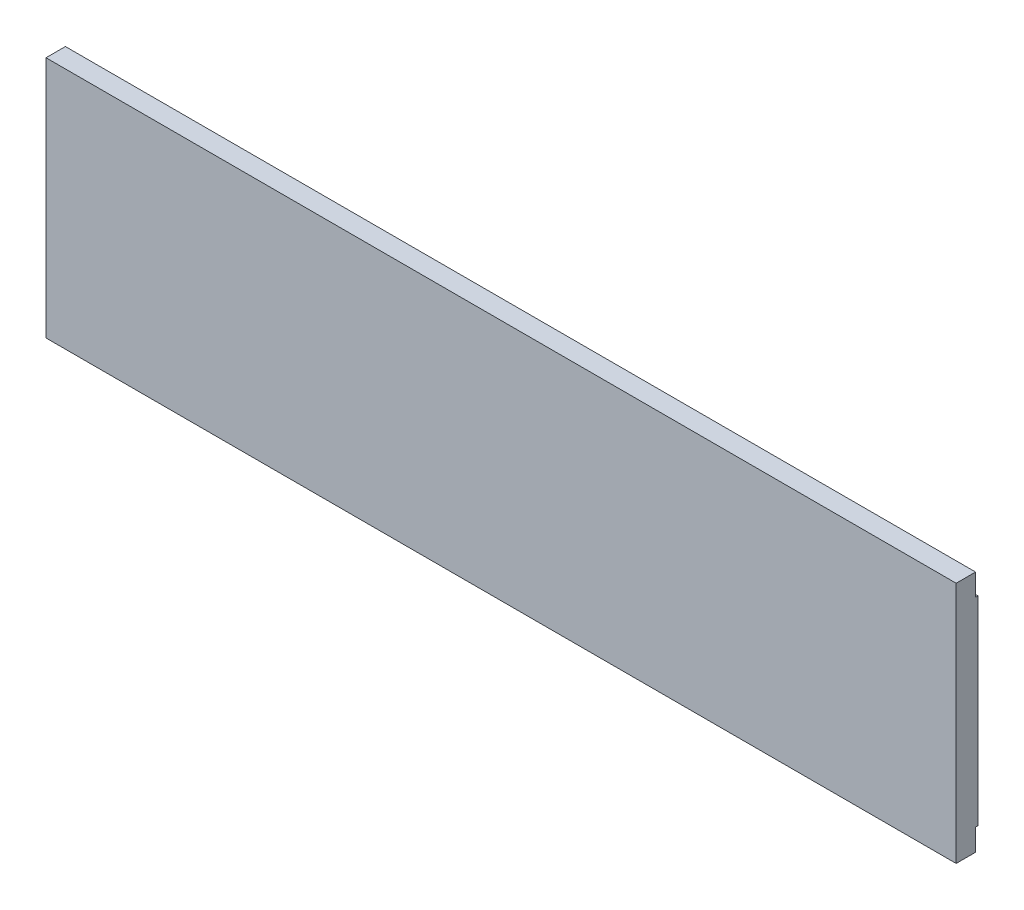
ISO-10303-21;
HEADER;
FILE_DESCRIPTION(('STEP AP214'),'2;1');
FILE_NAME('part.step','',(''),(''),'','','');
FILE_SCHEMA(('AUTOMOTIVE_DESIGN { 1 0 10303 214 1 1 1 1 }'));
ENDSEC;
DATA;
#1=APPLICATION_CONTEXT('core data for automotive mechanical design processes');
#2=APPLICATION_PROTOCOL_DEFINITION('international standard','automotive_design',2000,#1);
#3=PRODUCT_CONTEXT('',#1,'mechanical');
#4=PRODUCT('Part','Part','',(#3));
#5=PRODUCT_RELATED_PRODUCT_CATEGORY('part','',(#4));
#6=PRODUCT_DEFINITION_FORMATION('','',#4);
#7=PRODUCT_DEFINITION_CONTEXT('part definition',#1,'design');
#8=PRODUCT_DEFINITION('design','',#6,#7);
#9=PRODUCT_DEFINITION_SHAPE('','',#8);
#10=(LENGTH_UNIT() NAMED_UNIT(*) SI_UNIT(.MILLI.,.METRE.));
#11=(NAMED_UNIT(*) PLANE_ANGLE_UNIT() SI_UNIT($,.RADIAN.));
#12=(NAMED_UNIT(*) SI_UNIT($,.STERADIAN.) SOLID_ANGLE_UNIT());
#13=UNCERTAINTY_MEASURE_WITH_UNIT(LENGTH_MEASURE(1.E-05),#10,'distance_accuracy_value','');
#14=(GEOMETRIC_REPRESENTATION_CONTEXT(3) GLOBAL_UNCERTAINTY_ASSIGNED_CONTEXT((#13)) GLOBAL_UNIT_ASSIGNED_CONTEXT((#10,
#11,#12)) REPRESENTATION_CONTEXT('',''));
#15=CARTESIAN_POINT('',(0.,0.,0.));
#16=DIRECTION('',(0.,0.,1.));
#17=DIRECTION('',(1.,0.,0.));
#18=AXIS2_PLACEMENT_3D('',#15,#16,#17);
#19=CARTESIAN_POINT('',(0.,0.,0.));
#20=DIRECTION('',(0.,0.,1.));
#21=DIRECTION('',(1.,0.,0.));
#22=AXIS2_PLACEMENT_3D('',#19,#20,#21);
#23=PLANE('',#22);
#24=DIRECTION('',(-1.,0.,0.));
#25=VECTOR('',#24,1.);
#26=CARTESIAN_POINT('',(375.,82.,0.));
#27=LINE('',#26,#25);
#28=CARTESIAN_POINT('',(267.,82.,0.));
#29=VERTEX_POINT('',#28);
#30=CARTESIAN_POINT('',(147.,82.,0.));
#31=VERTEX_POINT('',#30);
#32=EDGE_CURVE('E231',#29,#31,#27,.T.);
#33=ORIENTED_EDGE('',*,*,#32,.F.);
#34=DIRECTION('',(0.,1.,0.));
#35=VECTOR('',#34,1.);
#36=CARTESIAN_POINT('',(267.,-136.962613609001,0.));
#37=LINE('',#36,#35);
#38=CARTESIAN_POINT('',(267.,-82.,0.));
#39=VERTEX_POINT('',#38);
#40=EDGE_CURVE('E220',#39,#29,#37,.T.);
#41=ORIENTED_EDGE('',*,*,#40,.F.);
#42=DIRECTION('',(-1.,0.,0.));
#43=VECTOR('',#42,1.);
#44=CARTESIAN_POINT('',(375.,-82.,0.));
#45=LINE('',#44,#43);
#46=CARTESIAN_POINT('',(147.,-82.,0.));
#47=VERTEX_POINT('',#46);
#48=EDGE_CURVE('E229',#39,#47,#45,.T.);
#49=ORIENTED_EDGE('',*,*,#48,.T.);
#50=DIRECTION('',(0.,-1.,0.));
#51=VECTOR('',#50,1.);
#52=CARTESIAN_POINT('',(147.,-149.113991927209,0.));
#53=LINE('',#52,#51);
#54=EDGE_CURVE('E394',#31,#47,#53,.T.);
#55=ORIENTED_EDGE('',*,*,#54,.F.);
#56=EDGE_LOOP('',(#33,#41,#49,#55));
#57=FACE_BOUND('',#56,.T.);
#58=ADVANCED_FACE('F33',(#57),#23,.F.);
#59=CARTESIAN_POINT('',(375.,-82.,0.));
#60=DIRECTION('',(0.,1.,0.));
#61=DIRECTION('',(0.,0.,1.));
#62=AXIS2_PLACEMENT_3D('',#59,#60,#61);
#63=PLANE('',#62);
#64=ORIENTED_EDGE('',*,*,#48,.F.);
#65=DIRECTION('',(0.,0.,1.));
#66=VECTOR('',#65,1.);
#67=CARTESIAN_POINT('',(267.,-82.,0.));
#68=LINE('',#67,#66);
#69=CARTESIAN_POINT('',(267.,-82.,2.));
#70=VERTEX_POINT('',#69);
#71=EDGE_CURVE('E217',#39,#70,#68,.T.);
#72=ORIENTED_EDGE('',*,*,#71,.T.);
#73=DIRECTION('',(-1.,0.,0.));
#74=VECTOR('',#73,1.);
#75=CARTESIAN_POINT('',(375.,-82.,2.));
#76=LINE('',#75,#74);
#77=CARTESIAN_POINT('',(147.,-82.,2.));
#78=VERTEX_POINT('',#77);
#79=EDGE_CURVE('E252',#70,#78,#76,.T.);
#80=ORIENTED_EDGE('',*,*,#79,.T.);
#81=DIRECTION('',(0.,0.,-1.));
#82=VECTOR('',#81,1.);
#83=CARTESIAN_POINT('',(147.,-82.,0.));
#84=LINE('',#83,#82);
#85=EDGE_CURVE('E237',#78,#47,#84,.T.);
#86=ORIENTED_EDGE('',*,*,#85,.T.);
#87=EDGE_LOOP('',(#64,#72,#80,#86));
#88=FACE_BOUND('',#87,.T.);
#89=ADVANCED_FACE('F235',(#88),#63,.F.);
#90=CARTESIAN_POINT('',(375.,82.,0.));
#91=DIRECTION('',(0.,-1.,0.));
#92=DIRECTION('',(0.,0.,-1.));
#93=AXIS2_PLACEMENT_3D('',#90,#91,#92);
#94=PLANE('',#93);
#95=DIRECTION('',(-1.,0.,0.));
#96=VECTOR('',#95,1.);
#97=CARTESIAN_POINT('',(375.,82.,2.));
#98=LINE('',#97,#96);
#99=CARTESIAN_POINT('',(267.,82.,2.));
#100=VERTEX_POINT('',#99);
#101=CARTESIAN_POINT('',(147.,82.,2.));
#102=VERTEX_POINT('',#101);
#103=EDGE_CURVE('E325',#100,#102,#98,.T.);
#104=ORIENTED_EDGE('',*,*,#103,.F.);
#105=DIRECTION('',(0.,0.,-1.));
#106=VECTOR('',#105,1.);
#107=CARTESIAN_POINT('',(267.,82.,0.));
#108=LINE('',#107,#106);
#109=EDGE_CURVE('E11',#100,#29,#108,.T.);
#110=ORIENTED_EDGE('',*,*,#109,.T.);
#111=ORIENTED_EDGE('',*,*,#32,.T.);
#112=DIRECTION('',(0.,0.,1.));
#113=VECTOR('',#112,1.);
#114=CARTESIAN_POINT('',(147.,82.,0.));
#115=LINE('',#114,#113);
#116=EDGE_CURVE('E301',#31,#102,#115,.T.);
#117=ORIENTED_EDGE('',*,*,#116,.T.);
#118=EDGE_LOOP('',(#104,#110,#111,#117));
#119=FACE_BOUND('',#118,.T.);
#120=ADVANCED_FACE('F471',(#119),#94,.F.);
#121=CARTESIAN_POINT('',(129.,82.,0.));
#122=VERTEX_POINT('',#121);
#123=CARTESIAN_POINT('',(8.99999999999996,82.,0.));
#124=VERTEX_POINT('',#123);
#125=EDGE_CURVE('E338',#122,#124,#27,.T.);
#126=ORIENTED_EDGE('',*,*,#125,.F.);
#127=DIRECTION('',(0.,1.,0.));
#128=VECTOR('',#127,1.);
#129=CARTESIAN_POINT('',(129.,-149.113991927209,0.));
#130=LINE('',#129,#128);
#131=CARTESIAN_POINT('',(129.,-82.,0.));
#132=VERTEX_POINT('',#131);
#133=EDGE_CURVE('E223',#132,#122,#130,.T.);
#134=ORIENTED_EDGE('',*,*,#133,.F.);
#135=CARTESIAN_POINT('',(8.99999999999996,-82.,0.));
#136=VERTEX_POINT('',#135);
#137=EDGE_CURVE('E239',#132,#136,#45,.T.);
#138=ORIENTED_EDGE('',*,*,#137,.T.);
#139=DIRECTION('',(0.,-1.,0.));
#140=VECTOR('',#139,1.);
#141=CARTESIAN_POINT('',(8.99999999999997,-149.113991927209,0.));
#142=LINE('',#141,#140);
#143=EDGE_CURVE('E407',#124,#136,#142,.T.);
#144=ORIENTED_EDGE('',*,*,#143,.F.);
#145=EDGE_LOOP('',(#126,#134,#138,#144));
#146=FACE_BOUND('',#145,.T.);
#147=ADVANCED_FACE('F473',(#146),#23,.F.);
#148=ORIENTED_EDGE('',*,*,#137,.F.);
#149=DIRECTION('',(0.,0.,1.));
#150=VECTOR('',#149,1.);
#151=CARTESIAN_POINT('',(129.,-82.,0.));
#152=LINE('',#151,#150);
#153=CARTESIAN_POINT('',(129.,-82.,2.));
#154=VERTEX_POINT('',#153);
#155=EDGE_CURVE('E400',#132,#154,#152,.T.);
#156=ORIENTED_EDGE('',*,*,#155,.T.);
#157=CARTESIAN_POINT('',(8.99999999999996,-82.,2.));
#158=VERTEX_POINT('',#157);
#159=EDGE_CURVE('E459',#154,#158,#76,.T.);
#160=ORIENTED_EDGE('',*,*,#159,.T.);
#161=DIRECTION('',(0.,0.,-1.));
#162=VECTOR('',#161,1.);
#163=CARTESIAN_POINT('',(8.99999999999995,-82.,0.));
#164=LINE('',#163,#162);
#165=EDGE_CURVE('E410',#158,#136,#164,.T.);
#166=ORIENTED_EDGE('',*,*,#165,.T.);
#167=EDGE_LOOP('',(#148,#156,#160,#166));
#168=FACE_BOUND('',#167,.T.);
#169=ADVANCED_FACE('F480',(#168),#63,.F.);
#170=CARTESIAN_POINT('',(129.,82.,2.));
#171=VERTEX_POINT('',#170);
#172=CARTESIAN_POINT('',(8.99999999999996,82.,2.));
#173=VERTEX_POINT('',#172);
#174=EDGE_CURVE('E330',#171,#173,#98,.T.);
#175=ORIENTED_EDGE('',*,*,#174,.F.);
#176=DIRECTION('',(0.,0.,-1.));
#177=VECTOR('',#176,1.);
#178=CARTESIAN_POINT('',(129.,82.,0.));
#179=LINE('',#178,#177);
#180=EDGE_CURVE('E304',#171,#122,#179,.T.);
#181=ORIENTED_EDGE('',*,*,#180,.T.);
#182=ORIENTED_EDGE('',*,*,#125,.T.);
#183=DIRECTION('',(0.,0.,1.));
#184=VECTOR('',#183,1.);
#185=CARTESIAN_POINT('',(8.99999999999995,82.,0.));
#186=LINE('',#185,#184);
#187=EDGE_CURVE('E295',#124,#173,#186,.T.);
#188=ORIENTED_EDGE('',*,*,#187,.T.);
#189=EDGE_LOOP('',(#175,#181,#182,#188));
#190=FACE_BOUND('',#189,.T.);
#191=ADVANCED_FACE('F475',(#190),#94,.F.);
#192=CARTESIAN_POINT('',(-9.00000000000004,82.,0.));
#193=VERTEX_POINT('',#192);
#194=CARTESIAN_POINT('',(-129.,82.,0.));
#195=VERTEX_POINT('',#194);
#196=EDGE_CURVE('E344',#193,#195,#27,.T.);
#197=ORIENTED_EDGE('',*,*,#196,.F.);
#198=DIRECTION('',(0.,1.,0.));
#199=VECTOR('',#198,1.);
#200=CARTESIAN_POINT('',(-9.00000000000004,-149.113991927209,0.));
#201=LINE('',#200,#199);
#202=CARTESIAN_POINT('',(-9.00000000000004,-82.,0.));
#203=VERTEX_POINT('',#202);
#204=EDGE_CURVE('E403',#203,#193,#201,.T.);
#205=ORIENTED_EDGE('',*,*,#204,.F.);
#206=CARTESIAN_POINT('',(-129.,-82.,0.));
#207=VERTEX_POINT('',#206);
#208=EDGE_CURVE('E244',#203,#207,#45,.T.);
#209=ORIENTED_EDGE('',*,*,#208,.T.);
#210=DIRECTION('',(0.,-1.,0.));
#211=VECTOR('',#210,1.);
#212=CARTESIAN_POINT('',(-129.,-160.738550975509,0.));
#213=LINE('',#212,#211);
#214=EDGE_CURVE('E423',#195,#207,#213,.T.);
#215=ORIENTED_EDGE('',*,*,#214,.F.);
#216=EDGE_LOOP('',(#197,#205,#209,#215));
#217=FACE_BOUND('',#216,.T.);
#218=ADVANCED_FACE('F483',(#217),#23,.F.);
#219=ORIENTED_EDGE('',*,*,#208,.F.);
#220=DIRECTION('',(0.,0.,1.));
#221=VECTOR('',#220,1.);
#222=CARTESIAN_POINT('',(-9.00000000000001,-82.,0.));
#223=LINE('',#222,#221);
#224=CARTESIAN_POINT('',(-9.00000000000004,-82.,2.));
#225=VERTEX_POINT('',#224);
#226=EDGE_CURVE('E416',#203,#225,#223,.T.);
#227=ORIENTED_EDGE('',*,*,#226,.T.);
#228=CARTESIAN_POINT('',(-129.,-82.,2.));
#229=VERTEX_POINT('',#228);
#230=EDGE_CURVE('E455',#225,#229,#76,.T.);
#231=ORIENTED_EDGE('',*,*,#230,.T.);
#232=DIRECTION('',(0.,0.,-1.));
#233=VECTOR('',#232,1.);
#234=CARTESIAN_POINT('',(-129.,-82.,0.));
#235=LINE('',#234,#233);
#236=EDGE_CURVE('E426',#229,#207,#235,.T.);
#237=ORIENTED_EDGE('',*,*,#236,.T.);
#238=EDGE_LOOP('',(#219,#227,#231,#237));
#239=FACE_BOUND('',#238,.T.);
#240=ADVANCED_FACE('F522',(#239),#63,.F.);
#241=CARTESIAN_POINT('',(-9.00000000000006,82.,2.));
#242=VERTEX_POINT('',#241);
#243=CARTESIAN_POINT('',(-129.,82.,2.));
#244=VERTEX_POINT('',#243);
#245=EDGE_CURVE('E336',#242,#244,#98,.T.);
#246=ORIENTED_EDGE('',*,*,#245,.F.);
#247=DIRECTION('',(0.,0.,-1.));
#248=VECTOR('',#247,1.);
#249=CARTESIAN_POINT('',(-9.00000000000001,82.,0.));
#250=LINE('',#249,#248);
#251=EDGE_CURVE('E298',#242,#193,#250,.T.);
#252=ORIENTED_EDGE('',*,*,#251,.T.);
#253=ORIENTED_EDGE('',*,*,#196,.T.);
#254=DIRECTION('',(0.,0.,1.));
#255=VECTOR('',#254,1.);
#256=CARTESIAN_POINT('',(-129.,82.,0.));
#257=LINE('',#256,#255);
#258=EDGE_CURVE('E289',#195,#244,#257,.T.);
#259=ORIENTED_EDGE('',*,*,#258,.T.);
#260=EDGE_LOOP('',(#246,#252,#253,#259));
#261=FACE_BOUND('',#260,.T.);
#262=ADVANCED_FACE('F489',(#261),#94,.F.);
#263=CARTESIAN_POINT('',(-147.,82.,0.));
#264=VERTEX_POINT('',#263);
#265=CARTESIAN_POINT('',(-267.,82.,0.));
#266=VERTEX_POINT('',#265);
#267=EDGE_CURVE('E340',#264,#266,#27,.T.);
#268=ORIENTED_EDGE('',*,*,#267,.F.);
#269=DIRECTION('',(0.,1.,0.));
#270=VECTOR('',#269,1.);
#271=CARTESIAN_POINT('',(-147.,-160.738550975509,0.));
#272=LINE('',#271,#270);
#273=CARTESIAN_POINT('',(-147.,-82.,0.));
#274=VERTEX_POINT('',#273);
#275=EDGE_CURVE('E419',#274,#264,#272,.T.);
#276=ORIENTED_EDGE('',*,*,#275,.F.);
#277=CARTESIAN_POINT('',(-267.,-82.,0.));
#278=VERTEX_POINT('',#277);
#279=EDGE_CURVE('E551',#274,#278,#45,.T.);
#280=ORIENTED_EDGE('',*,*,#279,.T.);
#281=DIRECTION('',(0.,-1.,0.));
#282=VECTOR('',#281,1.);
#283=CARTESIAN_POINT('',(-267.,-136.962613609001,0.));
#284=LINE('',#283,#282);
#285=EDGE_CURVE('E439',#266,#278,#284,.T.);
#286=ORIENTED_EDGE('',*,*,#285,.F.);
#287=EDGE_LOOP('',(#268,#276,#280,#286));
#288=FACE_BOUND('',#287,.T.);
#289=ADVANCED_FACE('F509',(#288),#23,.F.);
#290=ORIENTED_EDGE('',*,*,#279,.F.);
#291=DIRECTION('',(0.,0.,1.));
#292=VECTOR('',#291,1.);
#293=CARTESIAN_POINT('',(-147.,-82.,0.));
#294=LINE('',#293,#292);
#295=CARTESIAN_POINT('',(-147.,-82.,2.));
#296=VERTEX_POINT('',#295);
#297=EDGE_CURVE('E432',#274,#296,#294,.T.);
#298=ORIENTED_EDGE('',*,*,#297,.T.);
#299=CARTESIAN_POINT('',(-267.,-82.,2.));
#300=VERTEX_POINT('',#299);
#301=EDGE_CURVE('E454',#296,#300,#76,.T.);
#302=ORIENTED_EDGE('',*,*,#301,.T.);
#303=DIRECTION('',(0.,0.,-1.));
#304=VECTOR('',#303,1.);
#305=CARTESIAN_POINT('',(-267.,-82.,0.));
#306=LINE('',#305,#304);
#307=EDGE_CURVE('E442',#300,#278,#306,.T.);
#308=ORIENTED_EDGE('',*,*,#307,.T.);
#309=EDGE_LOOP('',(#290,#298,#302,#308));
#310=FACE_BOUND('',#309,.T.);
#311=ADVANCED_FACE('F514',(#310),#63,.F.);
#312=CARTESIAN_POINT('',(-147.,82.,2.));
#313=VERTEX_POINT('',#312);
#314=CARTESIAN_POINT('',(-267.,82.,2.));
#315=VERTEX_POINT('',#314);
#316=EDGE_CURVE('E332',#313,#315,#98,.T.);
#317=ORIENTED_EDGE('',*,*,#316,.F.);
#318=DIRECTION('',(0.,0.,-1.));
#319=VECTOR('',#318,1.);
#320=CARTESIAN_POINT('',(-147.,82.,0.));
#321=LINE('',#320,#319);
#322=EDGE_CURVE('E292',#313,#264,#321,.T.);
#323=ORIENTED_EDGE('',*,*,#322,.T.);
#324=ORIENTED_EDGE('',*,*,#267,.T.);
#325=DIRECTION('',(0.,0.,1.));
#326=VECTOR('',#325,1.);
#327=CARTESIAN_POINT('',(-267.,82.,0.));
#328=LINE('',#327,#326);
#329=EDGE_CURVE('E283',#266,#315,#328,.T.);
#330=ORIENTED_EDGE('',*,*,#329,.T.);
#331=EDGE_LOOP('',(#317,#323,#324,#330));
#332=FACE_BOUND('',#331,.T.);
#333=ADVANCED_FACE('F507',(#332),#94,.F.);
#334=CARTESIAN_POINT('',(-285.,82.,0.));
#335=VERTEX_POINT('',#334);
#336=CARTESIAN_POINT('',(-375.,82.,0.));
#337=VERTEX_POINT('',#336);
#338=EDGE_CURVE('E337',#335,#337,#27,.T.);
#339=ORIENTED_EDGE('',*,*,#338,.F.);
#340=DIRECTION('',(0.,1.,0.));
#341=VECTOR('',#340,1.);
#342=CARTESIAN_POINT('',(-285.,-136.962613609001,0.));
#343=LINE('',#342,#341);
#344=CARTESIAN_POINT('',(-285.,-82.,0.));
#345=VERTEX_POINT('',#344);
#346=EDGE_CURVE('E435',#345,#335,#343,.T.);
#347=ORIENTED_EDGE('',*,*,#346,.F.);
#348=CARTESIAN_POINT('',(-375.,-82.,0.));
#349=VERTEX_POINT('',#348);
#350=EDGE_CURVE('E243',#345,#349,#45,.T.);
#351=ORIENTED_EDGE('',*,*,#350,.T.);
#352=DIRECTION('',(0.,-1.,0.));
#353=VECTOR('',#352,1.);
#354=CARTESIAN_POINT('',(-375.,100.,0.));
#355=LINE('',#354,#353);
#356=EDGE_CURVE('E261',#337,#349,#355,.T.);
#357=ORIENTED_EDGE('',*,*,#356,.F.);
#358=EDGE_LOOP('',(#339,#347,#351,#357));
#359=FACE_BOUND('',#358,.T.);
#360=ADVANCED_FACE('F500',(#359),#23,.F.);
#361=ORIENTED_EDGE('',*,*,#350,.F.);
#362=DIRECTION('',(0.,0.,1.));
#363=VECTOR('',#362,1.);
#364=CARTESIAN_POINT('',(-285.,-82.,0.));
#365=LINE('',#364,#363);
#366=CARTESIAN_POINT('',(-285.,-82.,2.));
#367=VERTEX_POINT('',#366);
#368=EDGE_CURVE('E355',#345,#367,#365,.T.);
#369=ORIENTED_EDGE('',*,*,#368,.T.);
#370=CARTESIAN_POINT('',(-375.,-82.,2.));
#371=VERTEX_POINT('',#370);
#372=EDGE_CURVE('E253',#367,#371,#76,.T.);
#373=ORIENTED_EDGE('',*,*,#372,.T.);
#374=DIRECTION('',(0.,0.,-1.));
#375=VECTOR('',#374,1.);
#376=CARTESIAN_POINT('',(-375.,-82.,0.));
#377=LINE('',#376,#375);
#378=EDGE_CURVE('E247',#371,#349,#377,.T.);
#379=ORIENTED_EDGE('',*,*,#378,.T.);
#380=EDGE_LOOP('',(#361,#369,#373,#379));
#381=FACE_BOUND('',#380,.T.);
#382=ADVANCED_FACE('F450',(#381),#63,.F.);
#383=CARTESIAN_POINT('',(-285.,82.,2.));
#384=VERTEX_POINT('',#383);
#385=CARTESIAN_POINT('',(-375.,82.,2.));
#386=VERTEX_POINT('',#385);
#387=EDGE_CURVE('E327',#384,#386,#98,.T.);
#388=ORIENTED_EDGE('',*,*,#387,.F.);
#389=DIRECTION('',(0.,0.,-1.));
#390=VECTOR('',#389,1.);
#391=CARTESIAN_POINT('',(-285.,82.,0.));
#392=LINE('',#391,#390);
#393=EDGE_CURVE('E286',#384,#335,#392,.T.);
#394=ORIENTED_EDGE('',*,*,#393,.T.);
#395=ORIENTED_EDGE('',*,*,#338,.T.);
#396=DIRECTION('',(0.,0.,1.));
#397=VECTOR('',#396,1.);
#398=CARTESIAN_POINT('',(-375.,82.,0.));
#399=LINE('',#398,#397);
#400=EDGE_CURVE('E353',#337,#386,#399,.T.);
#401=ORIENTED_EDGE('',*,*,#400,.T.);
#402=EDGE_LOOP('',(#388,#394,#395,#401));
#403=FACE_BOUND('',#402,.T.);
#404=ADVANCED_FACE('F492',(#403),#94,.F.);
#405=CARTESIAN_POINT('',(375.,100.,18.));
#406=DIRECTION('',(-1.,0.,0.));
#407=DIRECTION('',(0.,0.,1.));
#408=AXIS2_PLACEMENT_3D('',#405,#406,#407);
#409=PLANE('',#408);
#410=DIRECTION('',(0.,0.,1.));
#411=VECTOR('',#410,1.);
#412=CARTESIAN_POINT('',(375.,82.,0.));
#413=LINE('',#412,#411);
#414=CARTESIAN_POINT('',(375.,82.,0.));
#415=VERTEX_POINT('',#414);
#416=CARTESIAN_POINT('',(375.,82.,2.));
#417=VERTEX_POINT('',#416);
#418=EDGE_CURVE('E345',#415,#417,#413,.T.);
#419=ORIENTED_EDGE('',*,*,#418,.T.);
#420=DIRECTION('',(0.,1.,0.));
#421=VECTOR('',#420,1.);
#422=CARTESIAN_POINT('',(375.,100.,2.));
#423=LINE('',#422,#421);
#424=CARTESIAN_POINT('',(375.,100.,2.));
#425=VERTEX_POINT('',#424);
#426=EDGE_CURVE('E322',#417,#425,#423,.T.);
#427=ORIENTED_EDGE('',*,*,#426,.T.);
#428=DIRECTION('',(0.,0.,-1.));
#429=VECTOR('',#428,1.);
#430=CARTESIAN_POINT('',(375.,100.,18.));
#431=LINE('',#430,#429);
#432=CARTESIAN_POINT('',(375.,100.,18.));
#433=VERTEX_POINT('',#432);
#434=EDGE_CURVE('E280',#433,#425,#431,.T.);
#435=ORIENTED_EDGE('',*,*,#434,.F.);
#436=DIRECTION('',(0.,1.,0.));
#437=VECTOR('',#436,1.);
#438=CARTESIAN_POINT('',(375.,100.,18.));
#439=LINE('',#438,#437);
#440=CARTESIAN_POINT('',(375.,-100.,18.));
#441=VERTEX_POINT('',#440);
#442=EDGE_CURVE('E257',#441,#433,#439,.T.);
#443=ORIENTED_EDGE('',*,*,#442,.F.);
#444=DIRECTION('',(0.,0.,-1.));
#445=VECTOR('',#444,1.);
#446=CARTESIAN_POINT('',(375.,-100.,18.));
#447=LINE('',#446,#445);
#448=CARTESIAN_POINT('',(375.,-100.,2.));
#449=VERTEX_POINT('',#448);
#450=EDGE_CURVE('E267',#441,#449,#447,.T.);
#451=ORIENTED_EDGE('',*,*,#450,.T.);
#452=DIRECTION('',(0.,1.,0.));
#453=VECTOR('',#452,1.);
#454=CARTESIAN_POINT('',(375.,-100.,2.));
#455=LINE('',#454,#453);
#456=CARTESIAN_POINT('',(375.,-82.,2.));
#457=VERTEX_POINT('',#456);
#458=EDGE_CURVE('E377',#449,#457,#455,.T.);
#459=ORIENTED_EDGE('',*,*,#458,.T.);
#460=DIRECTION('',(0.,0.,-1.));
#461=VECTOR('',#460,1.);
#462=CARTESIAN_POINT('',(375.,-82.,0.));
#463=LINE('',#462,#461);
#464=CARTESIAN_POINT('',(375.,-82.,0.));
#465=VERTEX_POINT('',#464);
#466=EDGE_CURVE('E256',#457,#465,#463,.T.);
#467=ORIENTED_EDGE('',*,*,#466,.T.);
#468=DIRECTION('',(0.,1.,0.));
#469=VECTOR('',#468,1.);
#470=CARTESIAN_POINT('',(375.,100.,0.));
#471=LINE('',#470,#469);
#472=EDGE_CURVE('E242',#465,#415,#471,.T.);
#473=ORIENTED_EDGE('',*,*,#472,.T.);
#474=EDGE_LOOP('',(#419,#427,#435,#443,#451,#459,#467,#473));
#475=FACE_BOUND('',#474,.T.);
#476=ADVANCED_FACE('F35',(#475),#409,.F.);
#477=CARTESIAN_POINT('',(-375.,100.,18.));
#478=DIRECTION('',(0.,-1.,0.));
#479=DIRECTION('',(0.,0.,-1.));
#480=AXIS2_PLACEMENT_3D('',#477,#478,#479);
#481=PLANE('',#480);
#482=ORIENTED_EDGE('',*,*,#434,.T.);
#483=DIRECTION('',(-1.,0.,0.));
#484=VECTOR('',#483,1.);
#485=CARTESIAN_POINT('',(375.,100.,2.));
#486=LINE('',#485,#484);
#487=CARTESIAN_POINT('',(-375.,100.,2.));
#488=VERTEX_POINT('',#487);
#489=EDGE_CURVE('E324',#425,#488,#486,.T.);
#490=ORIENTED_EDGE('',*,*,#489,.T.);
#491=DIRECTION('',(0.,0.,-1.));
#492=VECTOR('',#491,1.);
#493=CARTESIAN_POINT('',(-375.,100.,18.));
#494=LINE('',#493,#492);
#495=CARTESIAN_POINT('',(-375.,100.,18.));
#496=VERTEX_POINT('',#495);
#497=EDGE_CURVE('E277',#496,#488,#494,.T.);
#498=ORIENTED_EDGE('',*,*,#497,.F.);
#499=DIRECTION('',(-1.,0.,0.));
#500=VECTOR('',#499,1.);
#501=CARTESIAN_POINT('',(-375.,100.,18.));
#502=LINE('',#501,#500);
#503=EDGE_CURVE('E260',#433,#496,#502,.T.);
#504=ORIENTED_EDGE('',*,*,#503,.F.);
#505=EDGE_LOOP('',(#482,#490,#498,#504));
#506=FACE_BOUND('',#505,.T.);
#507=ADVANCED_FACE('F363',(#506),#481,.F.);
#508=CARTESIAN_POINT('',(-375.,100.,18.));
#509=DIRECTION('',(1.,0.,0.));
#510=DIRECTION('',(0.,0.,-1.));
#511=AXIS2_PLACEMENT_3D('',#508,#509,#510);
#512=PLANE('',#511);
#513=ORIENTED_EDGE('',*,*,#497,.T.);
#514=DIRECTION('',(0.,1.,0.));
#515=VECTOR('',#514,1.);
#516=CARTESIAN_POINT('',(-375.,100.,2.));
#517=LINE('',#516,#515);
#518=EDGE_CURVE('E349',#386,#488,#517,.T.);
#519=ORIENTED_EDGE('',*,*,#518,.F.);
#520=ORIENTED_EDGE('',*,*,#400,.F.);
#521=ORIENTED_EDGE('',*,*,#356,.T.);
#522=ORIENTED_EDGE('',*,*,#378,.F.);
#523=DIRECTION('',(0.,1.,0.));
#524=VECTOR('',#523,1.);
#525=CARTESIAN_POINT('',(-375.,-100.,2.));
#526=LINE('',#525,#524);
#527=CARTESIAN_POINT('',(-375.,-100.,2.));
#528=VERTEX_POINT('',#527);
#529=EDGE_CURVE('E328',#528,#371,#526,.T.);
#530=ORIENTED_EDGE('',*,*,#529,.F.);
#531=DIRECTION('',(0.,0.,-1.));
#532=VECTOR('',#531,1.);
#533=CARTESIAN_POINT('',(-375.,-100.,18.));
#534=LINE('',#533,#532);
#535=CARTESIAN_POINT('',(-375.,-100.,18.));
#536=VERTEX_POINT('',#535);
#537=EDGE_CURVE('E274',#536,#528,#534,.T.);
#538=ORIENTED_EDGE('',*,*,#537,.F.);
#539=DIRECTION('',(0.,-1.,0.));
#540=VECTOR('',#539,1.);
#541=CARTESIAN_POINT('',(-375.,100.,18.));
#542=LINE('',#541,#540);
#543=EDGE_CURVE('E263',#496,#536,#542,.T.);
#544=ORIENTED_EDGE('',*,*,#543,.F.);
#545=EDGE_LOOP('',(#513,#519,#520,#521,#522,#530,#538,#544));
#546=FACE_BOUND('',#545,.T.);
#547=ADVANCED_FACE('F360',(#546),#512,.F.);
#548=CARTESIAN_POINT('',(-375.,-100.,18.));
#549=DIRECTION('',(0.,1.,0.));
#550=DIRECTION('',(0.,0.,1.));
#551=AXIS2_PLACEMENT_3D('',#548,#549,#550);
#552=PLANE('',#551);
#553=ORIENTED_EDGE('',*,*,#537,.T.);
#554=DIRECTION('',(-1.,0.,0.));
#555=VECTOR('',#554,1.);
#556=CARTESIAN_POINT('',(375.,-100.,2.));
#557=LINE('',#556,#555);
#558=EDGE_CURVE('E254',#449,#528,#557,.T.);
#559=ORIENTED_EDGE('',*,*,#558,.F.);
#560=ORIENTED_EDGE('',*,*,#450,.F.);
#561=DIRECTION('',(1.,0.,0.));
#562=VECTOR('',#561,1.);
#563=CARTESIAN_POINT('',(-375.,-100.,18.));
#564=LINE('',#563,#562);
#565=EDGE_CURVE('E265',#536,#441,#564,.T.);
#566=ORIENTED_EDGE('',*,*,#565,.F.);
#567=EDGE_LOOP('',(#553,#559,#560,#566));
#568=FACE_BOUND('',#567,.T.);
#569=ADVANCED_FACE('F372',(#568),#552,.F.);
#570=CARTESIAN_POINT('',(0.,0.,18.));
#571=DIRECTION('',(0.,0.,1.));
#572=DIRECTION('',(1.,0.,0.));
#573=AXIS2_PLACEMENT_3D('',#570,#571,#572);
#574=PLANE('',#573);
#575=ORIENTED_EDGE('',*,*,#442,.T.);
#576=ORIENTED_EDGE('',*,*,#503,.T.);
#577=ORIENTED_EDGE('',*,*,#543,.T.);
#578=ORIENTED_EDGE('',*,*,#565,.T.);
#579=EDGE_LOOP('',(#575,#576,#577,#578));
#580=FACE_BOUND('',#579,.T.);
#581=ADVANCED_FACE('F368',(#580),#574,.T.);
#582=CARTESIAN_POINT('',(285.,-82.,0.));
#583=VERTEX_POINT('',#582);
#584=EDGE_CURVE('E238',#465,#583,#45,.T.);
#585=ORIENTED_EDGE('',*,*,#584,.T.);
#586=DIRECTION('',(0.,-1.,0.));
#587=VECTOR('',#586,1.);
#588=CARTESIAN_POINT('',(285.,-136.962613609001,0.));
#589=LINE('',#588,#587);
#590=CARTESIAN_POINT('',(285.,82.,0.));
#591=VERTEX_POINT('',#590);
#592=EDGE_CURVE('E232',#591,#583,#589,.T.);
#593=ORIENTED_EDGE('',*,*,#592,.F.);
#594=EDGE_CURVE('E314',#415,#591,#27,.T.);
#595=ORIENTED_EDGE('',*,*,#594,.F.);
#596=ORIENTED_EDGE('',*,*,#472,.F.);
#597=EDGE_LOOP('',(#585,#593,#595,#596));
#598=FACE_BOUND('',#597,.T.);
#599=ADVANCED_FACE('F385',(#598),#23,.F.);
#600=CARTESIAN_POINT('',(285.,-82.,2.));
#601=VERTEX_POINT('',#600);
#602=EDGE_CURVE('E249',#457,#601,#76,.T.);
#603=ORIENTED_EDGE('',*,*,#602,.T.);
#604=DIRECTION('',(0.,0.,-1.));
#605=VECTOR('',#604,1.);
#606=CARTESIAN_POINT('',(285.,-82.,0.));
#607=LINE('',#606,#605);
#608=EDGE_CURVE('E224',#601,#583,#607,.T.);
#609=ORIENTED_EDGE('',*,*,#608,.T.);
#610=ORIENTED_EDGE('',*,*,#584,.F.);
#611=ORIENTED_EDGE('',*,*,#466,.F.);
#612=EDGE_LOOP('',(#603,#609,#610,#611));
#613=FACE_BOUND('',#612,.T.);
#614=ADVANCED_FACE('F485',(#613),#63,.F.);
#615=CARTESIAN_POINT('',(375.,-100.,2.));
#616=DIRECTION('',(0.,0.,1.));
#617=DIRECTION('',(1.,0.,0.));
#618=AXIS2_PLACEMENT_3D('',#615,#616,#617);
#619=PLANE('',#618);
#620=ORIENTED_EDGE('',*,*,#79,.F.);
#621=DIRECTION('',(0.,1.,0.));
#622=VECTOR('',#621,1.);
#623=CARTESIAN_POINT('',(267.,-136.962613609001,2.));
#624=LINE('',#623,#622);
#625=EDGE_CURVE('E48',#70,#100,#624,.T.);
#626=ORIENTED_EDGE('',*,*,#625,.T.);
#627=ORIENTED_EDGE('',*,*,#103,.T.);
#628=DIRECTION('',(0.,-1.,0.));
#629=VECTOR('',#628,1.);
#630=CARTESIAN_POINT('',(147.,-149.113991927209,2.));
#631=LINE('',#630,#629);
#632=EDGE_CURVE('E393',#102,#78,#631,.T.);
#633=ORIENTED_EDGE('',*,*,#632,.T.);
#634=EDGE_LOOP('',(#620,#626,#627,#633));
#635=FACE_BOUND('',#634,.T.);
#636=CARTESIAN_POINT('',(285.,82.,2.));
#637=VERTEX_POINT('',#636);
#638=EDGE_CURVE('E311',#417,#637,#98,.T.);
#639=ORIENTED_EDGE('',*,*,#638,.T.);
#640=DIRECTION('',(0.,-1.,0.));
#641=VECTOR('',#640,1.);
#642=CARTESIAN_POINT('',(285.,-136.962613609001,2.));
#643=LINE('',#642,#641);
#644=EDGE_CURVE('E320',#637,#601,#643,.T.);
#645=ORIENTED_EDGE('',*,*,#644,.T.);
#646=ORIENTED_EDGE('',*,*,#602,.F.);
#647=ORIENTED_EDGE('',*,*,#458,.F.);
#648=ORIENTED_EDGE('',*,*,#558,.T.);
#649=ORIENTED_EDGE('',*,*,#529,.T.);
#650=ORIENTED_EDGE('',*,*,#372,.F.);
#651=DIRECTION('',(0.,1.,0.));
#652=VECTOR('',#651,1.);
#653=CARTESIAN_POINT('',(-285.,-136.962613609001,2.));
#654=LINE('',#653,#652);
#655=EDGE_CURVE('E436',#367,#384,#654,.T.);
#656=ORIENTED_EDGE('',*,*,#655,.T.);
#657=ORIENTED_EDGE('',*,*,#387,.T.);
#658=ORIENTED_EDGE('',*,*,#518,.T.);
#659=ORIENTED_EDGE('',*,*,#489,.F.);
#660=ORIENTED_EDGE('',*,*,#426,.F.);
#661=EDGE_LOOP('',(#639,#645,#646,#647,#648,#649,#650,#656,#657,#658,#659,#660));
#662=FACE_BOUND('',#661,.T.);
#663=ORIENTED_EDGE('',*,*,#159,.F.);
#664=DIRECTION('',(0.,1.,0.));
#665=VECTOR('',#664,1.);
#666=CARTESIAN_POINT('',(129.,-149.113991927209,2.));
#667=LINE('',#666,#665);
#668=EDGE_CURVE('E56',#154,#171,#667,.T.);
#669=ORIENTED_EDGE('',*,*,#668,.T.);
#670=ORIENTED_EDGE('',*,*,#174,.T.);
#671=DIRECTION('',(0.,-1.,0.));
#672=VECTOR('',#671,1.);
#673=CARTESIAN_POINT('',(8.99999999999997,-149.113991927209,2.));
#674=LINE('',#673,#672);
#675=EDGE_CURVE('E406',#173,#158,#674,.T.);
#676=ORIENTED_EDGE('',*,*,#675,.T.);
#677=EDGE_LOOP('',(#663,#669,#670,#676));
#678=FACE_BOUND('',#677,.T.);
#679=ORIENTED_EDGE('',*,*,#230,.F.);
#680=DIRECTION('',(0.,1.,0.));
#681=VECTOR('',#680,1.);
#682=CARTESIAN_POINT('',(-9.00000000000004,-149.113991927209,2.));
#683=LINE('',#682,#681);
#684=EDGE_CURVE('E404',#225,#242,#683,.T.);
#685=ORIENTED_EDGE('',*,*,#684,.T.);
#686=ORIENTED_EDGE('',*,*,#245,.T.);
#687=DIRECTION('',(0.,-1.,0.));
#688=VECTOR('',#687,1.);
#689=CARTESIAN_POINT('',(-129.,-160.738550975509,2.));
#690=LINE('',#689,#688);
#691=EDGE_CURVE('E422',#244,#229,#690,.T.);
#692=ORIENTED_EDGE('',*,*,#691,.T.);
#693=EDGE_LOOP('',(#679,#685,#686,#692));
#694=FACE_BOUND('',#693,.T.);
#695=ORIENTED_EDGE('',*,*,#301,.F.);
#696=DIRECTION('',(0.,1.,0.));
#697=VECTOR('',#696,1.);
#698=CARTESIAN_POINT('',(-147.,-160.738550975509,2.));
#699=LINE('',#698,#697);
#700=EDGE_CURVE('E420',#296,#313,#699,.T.);
#701=ORIENTED_EDGE('',*,*,#700,.T.);
#702=ORIENTED_EDGE('',*,*,#316,.T.);
#703=DIRECTION('',(0.,-1.,0.));
#704=VECTOR('',#703,1.);
#705=CARTESIAN_POINT('',(-267.,-136.962613609001,2.));
#706=LINE('',#705,#704);
#707=EDGE_CURVE('E438',#315,#300,#706,.T.);
#708=ORIENTED_EDGE('',*,*,#707,.T.);
#709=EDGE_LOOP('',(#695,#701,#702,#708));
#710=FACE_BOUND('',#709,.T.);
#711=ADVANCED_FACE('F319',(#635,#662,#678,#694,#710),#619,.F.);
#712=ORIENTED_EDGE('',*,*,#594,.T.);
#713=DIRECTION('',(0.,0.,1.));
#714=VECTOR('',#713,1.);
#715=CARTESIAN_POINT('',(285.,82.,0.));
#716=LINE('',#715,#714);
#717=EDGE_CURVE('E41',#591,#637,#716,.T.);
#718=ORIENTED_EDGE('',*,*,#717,.T.);
#719=ORIENTED_EDGE('',*,*,#638,.F.);
#720=ORIENTED_EDGE('',*,*,#418,.F.);
#721=EDGE_LOOP('',(#712,#718,#719,#720));
#722=FACE_BOUND('',#721,.T.);
#723=ADVANCED_FACE('F310',(#722),#94,.F.);
#724=CARTESIAN_POINT('',(-285.,-136.962613609001,2.));
#725=DIRECTION('',(-1.,0.,0.));
#726=DIRECTION('',(0.,0.,1.));
#727=AXIS2_PLACEMENT_3D('',#724,#725,#726);
#728=PLANE('',#727);
#729=ORIENTED_EDGE('',*,*,#346,.T.);
#730=ORIENTED_EDGE('',*,*,#393,.F.);
#731=ORIENTED_EDGE('',*,*,#655,.F.);
#732=ORIENTED_EDGE('',*,*,#368,.F.);
#733=EDGE_LOOP('',(#729,#730,#731,#732));
#734=FACE_BOUND('',#733,.T.);
#735=ADVANCED_FACE('F491',(#734),#728,.F.);
#736=CARTESIAN_POINT('',(-267.,-136.962613609001,2.));
#737=DIRECTION('',(1.,0.,0.));
#738=DIRECTION('',(0.,0.,-1.));
#739=AXIS2_PLACEMENT_3D('',#736,#737,#738);
#740=PLANE('',#739);
#741=ORIENTED_EDGE('',*,*,#707,.F.);
#742=ORIENTED_EDGE('',*,*,#329,.F.);
#743=ORIENTED_EDGE('',*,*,#285,.T.);
#744=ORIENTED_EDGE('',*,*,#307,.F.);
#745=EDGE_LOOP('',(#741,#742,#743,#744));
#746=FACE_BOUND('',#745,.T.);
#747=ADVANCED_FACE('F557',(#746),#740,.F.);
#748=CARTESIAN_POINT('',(-147.,-160.738550975509,2.));
#749=DIRECTION('',(-1.,0.,0.));
#750=DIRECTION('',(0.,0.,1.));
#751=AXIS2_PLACEMENT_3D('',#748,#749,#750);
#752=PLANE('',#751);
#753=ORIENTED_EDGE('',*,*,#275,.T.);
#754=ORIENTED_EDGE('',*,*,#322,.F.);
#755=ORIENTED_EDGE('',*,*,#700,.F.);
#756=ORIENTED_EDGE('',*,*,#297,.F.);
#757=EDGE_LOOP('',(#753,#754,#755,#756));
#758=FACE_BOUND('',#757,.T.);
#759=ADVANCED_FACE('F562',(#758),#752,.F.);
#760=CARTESIAN_POINT('',(-129.,-160.738550975509,2.));
#761=DIRECTION('',(1.,0.,0.));
#762=DIRECTION('',(0.,1.,0.));
#763=AXIS2_PLACEMENT_3D('',#760,#761,#762);
#764=PLANE('',#763);
#765=ORIENTED_EDGE('',*,*,#691,.F.);
#766=ORIENTED_EDGE('',*,*,#258,.F.);
#767=ORIENTED_EDGE('',*,*,#214,.T.);
#768=ORIENTED_EDGE('',*,*,#236,.F.);
#769=EDGE_LOOP('',(#765,#766,#767,#768));
#770=FACE_BOUND('',#769,.T.);
#771=ADVANCED_FACE('F550',(#770),#764,.F.);
#772=CARTESIAN_POINT('',(-9.00000000000004,-149.113991927209,2.));
#773=DIRECTION('',(-1.,0.,0.));
#774=DIRECTION('',(0.,0.,1.));
#775=AXIS2_PLACEMENT_3D('',#772,#773,#774);
#776=PLANE('',#775);
#777=ORIENTED_EDGE('',*,*,#204,.T.);
#778=ORIENTED_EDGE('',*,*,#251,.F.);
#779=ORIENTED_EDGE('',*,*,#684,.F.);
#780=ORIENTED_EDGE('',*,*,#226,.F.);
#781=EDGE_LOOP('',(#777,#778,#779,#780));
#782=FACE_BOUND('',#781,.T.);
#783=ADVANCED_FACE('F571',(#782),#776,.F.);
#784=CARTESIAN_POINT('',(8.99999999999997,-149.113991927209,2.));
#785=DIRECTION('',(1.,0.,0.));
#786=DIRECTION('',(0.,1.,0.));
#787=AXIS2_PLACEMENT_3D('',#784,#785,#786);
#788=PLANE('',#787);
#789=ORIENTED_EDGE('',*,*,#675,.F.);
#790=ORIENTED_EDGE('',*,*,#187,.F.);
#791=ORIENTED_EDGE('',*,*,#143,.T.);
#792=ORIENTED_EDGE('',*,*,#165,.F.);
#793=EDGE_LOOP('',(#789,#790,#791,#792));
#794=FACE_BOUND('',#793,.T.);
#795=ADVANCED_FACE('F542',(#794),#788,.F.);
#796=CARTESIAN_POINT('',(129.,-149.113991927209,2.));
#797=DIRECTION('',(-1.,0.,0.));
#798=DIRECTION('',(0.,0.,1.));
#799=AXIS2_PLACEMENT_3D('',#796,#797,#798);
#800=PLANE('',#799);
#801=ORIENTED_EDGE('',*,*,#133,.T.);
#802=ORIENTED_EDGE('',*,*,#180,.F.);
#803=ORIENTED_EDGE('',*,*,#668,.F.);
#804=ORIENTED_EDGE('',*,*,#155,.F.);
#805=EDGE_LOOP('',(#801,#802,#803,#804));
#806=FACE_BOUND('',#805,.T.);
#807=ADVANCED_FACE('F577',(#806),#800,.F.);
#808=CARTESIAN_POINT('',(147.,-149.113991927209,2.));
#809=DIRECTION('',(1.,0.,0.));
#810=DIRECTION('',(0.,0.,-1.));
#811=AXIS2_PLACEMENT_3D('',#808,#809,#810);
#812=PLANE('',#811);
#813=ORIENTED_EDGE('',*,*,#632,.F.);
#814=ORIENTED_EDGE('',*,*,#116,.F.);
#815=ORIENTED_EDGE('',*,*,#54,.T.);
#816=ORIENTED_EDGE('',*,*,#85,.F.);
#817=EDGE_LOOP('',(#813,#814,#815,#816));
#818=FACE_BOUND('',#817,.T.);
#819=ADVANCED_FACE('F467',(#818),#812,.F.);
#820=CARTESIAN_POINT('',(267.,-136.962613609001,2.));
#821=DIRECTION('',(-1.,0.,0.));
#822=DIRECTION('',(0.,0.,1.));
#823=AXIS2_PLACEMENT_3D('',#820,#821,#822);
#824=PLANE('',#823);
#825=ORIENTED_EDGE('',*,*,#40,.T.);
#826=ORIENTED_EDGE('',*,*,#109,.F.);
#827=ORIENTED_EDGE('',*,*,#625,.F.);
#828=ORIENTED_EDGE('',*,*,#71,.F.);
#829=EDGE_LOOP('',(#825,#826,#827,#828));
#830=FACE_BOUND('',#829,.T.);
#831=ADVANCED_FACE('F219',(#830),#824,.F.);
#832=CARTESIAN_POINT('',(285.,-136.962613609001,2.));
#833=DIRECTION('',(1.,0.,0.));
#834=DIRECTION('',(0.,0.,-1.));
#835=AXIS2_PLACEMENT_3D('',#832,#833,#834);
#836=PLANE('',#835);
#837=ORIENTED_EDGE('',*,*,#644,.F.);
#838=ORIENTED_EDGE('',*,*,#717,.F.);
#839=ORIENTED_EDGE('',*,*,#592,.T.);
#840=ORIENTED_EDGE('',*,*,#608,.F.);
#841=EDGE_LOOP('',(#837,#838,#839,#840));
#842=FACE_BOUND('',#841,.T.);
#843=ADVANCED_FACE('F585',(#842),#836,.F.);
#844=CLOSED_SHELL('',(#58,#89,#120,#147,#169,#191,#218,#240,#262,#289,#311,#333,#360,#382,#404,
#476,#507,#547,#569,#581,#599,#614,#711,#723,#735,#747,#759,#771,#783,#795,#807,#819,#831,#843));
#845=MANIFOLD_SOLID_BREP('B2',#844);
#846=ADVANCED_BREP_SHAPE_REPRESENTATION('',(#18,#845),#14);
#847=SHAPE_DEFINITION_REPRESENTATION(#9,#846);
ENDSEC;
END-ISO-10303-21;
